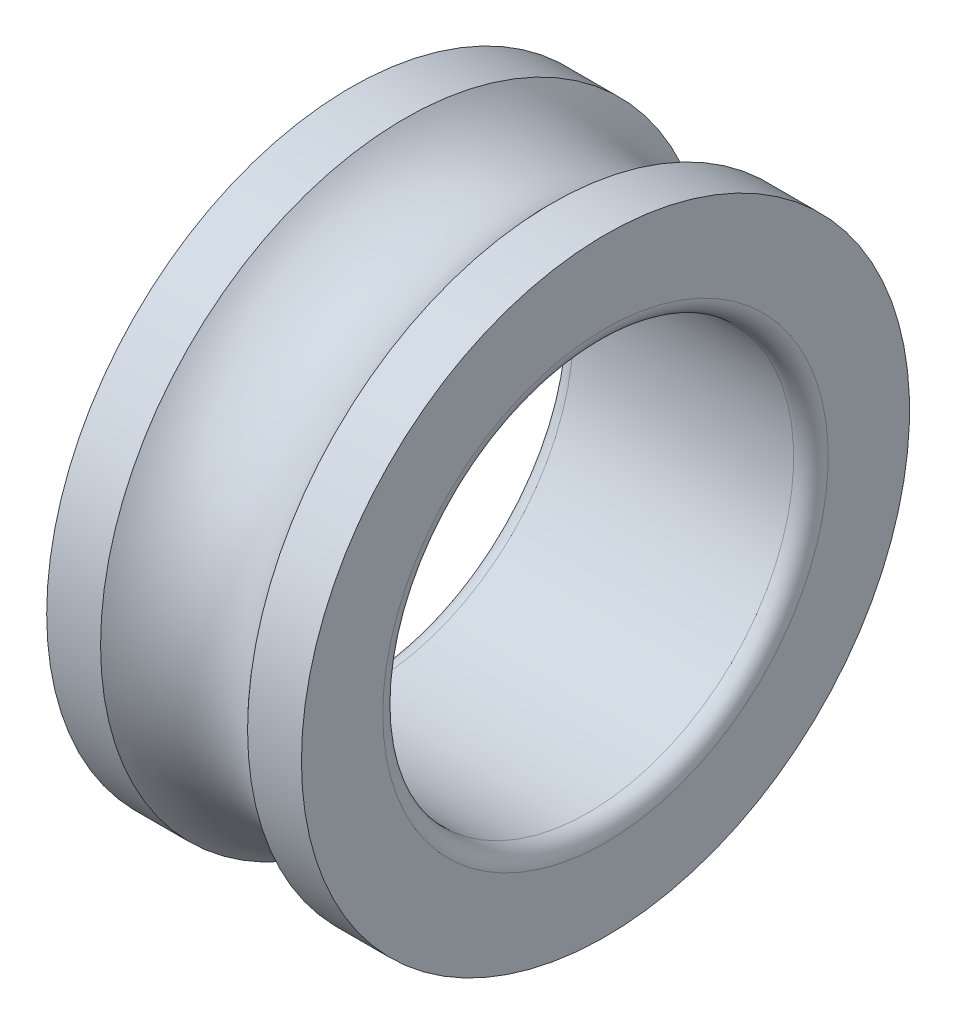
ISO-10303-21;
HEADER;
FILE_DESCRIPTION(('STEP AP214'),'2;1');
FILE_NAME('part.step','',(''),(''),'','','');
FILE_SCHEMA(('AUTOMOTIVE_DESIGN { 1 0 10303 214 1 1 1 1 }'));
ENDSEC;
DATA;
#1=APPLICATION_CONTEXT('core data for automotive mechanical design processes');
#2=APPLICATION_PROTOCOL_DEFINITION('international standard','automotive_design',2000,#1);
#3=PRODUCT_CONTEXT('',#1,'mechanical');
#4=PRODUCT('Part','Part','',(#3));
#5=PRODUCT_RELATED_PRODUCT_CATEGORY('part','',(#4));
#6=PRODUCT_DEFINITION_FORMATION('','',#4);
#7=PRODUCT_DEFINITION_CONTEXT('part definition',#1,'design');
#8=PRODUCT_DEFINITION('design','',#6,#7);
#9=PRODUCT_DEFINITION_SHAPE('','',#8);
#10=(LENGTH_UNIT() NAMED_UNIT(*) SI_UNIT(.MILLI.,.METRE.));
#11=(NAMED_UNIT(*) PLANE_ANGLE_UNIT() SI_UNIT($,.RADIAN.));
#12=(NAMED_UNIT(*) SI_UNIT($,.STERADIAN.) SOLID_ANGLE_UNIT());
#13=UNCERTAINTY_MEASURE_WITH_UNIT(LENGTH_MEASURE(1.E-05),#10,'distance_accuracy_value','');
#14=(GEOMETRIC_REPRESENTATION_CONTEXT(3) GLOBAL_UNCERTAINTY_ASSIGNED_CONTEXT((#13)) GLOBAL_UNIT_ASSIGNED_CONTEXT((#10,
#11,#12)) REPRESENTATION_CONTEXT('',''));
#15=CARTESIAN_POINT('',(0.,0.,0.));
#16=DIRECTION('',(0.,0.,1.));
#17=DIRECTION('',(1.,0.,0.));
#18=AXIS2_PLACEMENT_3D('',#15,#16,#17);
#19=CARTESIAN_POINT('',(-15.5,37.,0.));
#20=DIRECTION('',(1.,0.,0.));
#21=DIRECTION('',(0.,0.,-1.));
#22=AXIS2_PLACEMENT_3D('',#19,#20,#21);
#23=PLANE('',#22);
#24=CARTESIAN_POINT('',(-15.5,0.,0.));
#25=DIRECTION('',(-1.,0.,0.));
#26=DIRECTION('',(0.,0.,1.));
#27=AXIS2_PLACEMENT_3D('',#24,#25,#26);
#28=CIRCLE('',#27,27.1);
#29=CARTESIAN_POINT('',(-15.5,0.,27.1));
#30=VERTEX_POINT('',#29);
#31=EDGE_CURVE('E10',#30,#30,#28,.T.);
#32=ORIENTED_EDGE('',*,*,#31,.F.);
#33=EDGE_LOOP('',(#32));
#34=FACE_BOUND('',#33,.T.);
#35=CARTESIAN_POINT('',(-15.5,0.,0.));
#36=DIRECTION('',(-1.,0.,0.));
#37=DIRECTION('',(0.,0.,1.));
#38=AXIS2_PLACEMENT_3D('',#35,#36,#37);
#39=CIRCLE('',#38,37.);
#40=CARTESIAN_POINT('',(-15.5,0.,37.));
#41=VERTEX_POINT('',#40);
#42=EDGE_CURVE('E59',#41,#41,#39,.T.);
#43=ORIENTED_EDGE('',*,*,#42,.T.);
#44=EDGE_LOOP('',(#43));
#45=FACE_BOUND('',#44,.T.);
#46=ADVANCED_FACE('F31',(#34,#45),#23,.F.);
#47=CARTESIAN_POINT('',(-13.4,0.,0.));
#48=DIRECTION('',(-1.,0.,0.));
#49=DIRECTION('',(0.,0.,1.));
#50=AXIS2_PLACEMENT_3D('',#47,#48,#49);
#51=TOROIDAL_SURFACE('',#50,27.1,2.1);
#52=CARTESIAN_POINT('',(-13.4,0.,0.));
#53=DIRECTION('',(-1.,0.,0.));
#54=DIRECTION('',(0.,0.,1.));
#55=AXIS2_PLACEMENT_3D('',#52,#53,#54);
#56=CIRCLE('',#55,25.);
#57=CARTESIAN_POINT('',(-13.4,0.,25.));
#58=VERTEX_POINT('',#57);
#59=EDGE_CURVE('E37',#58,#58,#56,.T.);
#60=ORIENTED_EDGE('',*,*,#59,.F.);
#61=EDGE_LOOP('',(#60));
#62=FACE_BOUND('',#61,.T.);
#63=ORIENTED_EDGE('',*,*,#31,.T.);
#64=EDGE_LOOP('',(#63));
#65=FACE_BOUND('',#64,.T.);
#66=ADVANCED_FACE('F96',(#62,#65),#51,.T.);
#67=CARTESIAN_POINT('',(-12.3367346938775,0.,0.));
#68=DIRECTION('',(-1.,0.,0.));
#69=DIRECTION('',(0.,0.,1.));
#70=AXIS2_PLACEMENT_3D('',#67,#68,#69);
#71=CYLINDRICAL_SURFACE('',#70,25.);
#72=CARTESIAN_POINT('',(13.4,0.,0.));
#73=DIRECTION('',(-1.,0.,0.));
#74=DIRECTION('',(0.,0.,1.));
#75=AXIS2_PLACEMENT_3D('',#72,#73,#74);
#76=CIRCLE('',#75,25.);
#77=CARTESIAN_POINT('',(13.4,0.,25.));
#78=VERTEX_POINT('',#77);
#79=EDGE_CURVE('E41',#78,#78,#76,.T.);
#80=ORIENTED_EDGE('',*,*,#79,.F.);
#81=EDGE_LOOP('',(#80));
#82=FACE_BOUND('',#81,.T.);
#83=ORIENTED_EDGE('',*,*,#59,.T.);
#84=EDGE_LOOP('',(#83));
#85=FACE_BOUND('',#84,.T.);
#86=ADVANCED_FACE('F91',(#82,#85),#71,.F.);
#87=CARTESIAN_POINT('',(13.4,0.,0.));
#88=DIRECTION('',(-1.,0.,0.));
#89=DIRECTION('',(0.,0.,1.));
#90=AXIS2_PLACEMENT_3D('',#87,#88,#89);
#91=TOROIDAL_SURFACE('',#90,27.1,2.1);
#92=CARTESIAN_POINT('',(15.5,0.,0.));
#93=DIRECTION('',(-1.,0.,0.));
#94=DIRECTION('',(0.,0.,1.));
#95=AXIS2_PLACEMENT_3D('',#92,#93,#94);
#96=CIRCLE('',#95,27.1);
#97=CARTESIAN_POINT('',(15.5,0.,27.1));
#98=VERTEX_POINT('',#97);
#99=EDGE_CURVE('E45',#98,#98,#96,.T.);
#100=ORIENTED_EDGE('',*,*,#99,.F.);
#101=EDGE_LOOP('',(#100));
#102=FACE_BOUND('',#101,.T.);
#103=ORIENTED_EDGE('',*,*,#79,.T.);
#104=EDGE_LOOP('',(#103));
#105=FACE_BOUND('',#104,.T.);
#106=ADVANCED_FACE('F85',(#102,#105),#91,.T.);
#107=CARTESIAN_POINT('',(15.5,37.,0.));
#108=DIRECTION('',(-1.,0.,0.));
#109=DIRECTION('',(0.,0.,1.));
#110=AXIS2_PLACEMENT_3D('',#107,#108,#109);
#111=PLANE('',#110);
#112=CARTESIAN_POINT('',(15.5,0.,0.));
#113=DIRECTION('',(-1.,0.,0.));
#114=DIRECTION('',(0.,0.,1.));
#115=AXIS2_PLACEMENT_3D('',#112,#113,#114);
#116=CIRCLE('',#115,37.);
#117=CARTESIAN_POINT('',(15.5,0.,37.));
#118=VERTEX_POINT('',#117);
#119=EDGE_CURVE('E50',#118,#118,#116,.T.);
#120=ORIENTED_EDGE('',*,*,#119,.F.);
#121=EDGE_LOOP('',(#120));
#122=FACE_BOUND('',#121,.T.);
#123=ORIENTED_EDGE('',*,*,#99,.T.);
#124=EDGE_LOOP('',(#123));
#125=FACE_BOUND('',#124,.T.);
#126=ADVANCED_FACE('F79',(#122,#125),#111,.F.);
#127=CARTESIAN_POINT('',(-12.3367346938775,0.,0.));
#128=DIRECTION('',(-1.,0.,0.));
#129=DIRECTION('',(0.,0.,1.));
#130=AXIS2_PLACEMENT_3D('',#127,#128,#129);
#131=CYLINDRICAL_SURFACE('',#130,37.);
#132=CARTESIAN_POINT('',(8.94427190999916,0.,0.));
#133=DIRECTION('',(-1.,0.,0.));
#134=DIRECTION('',(0.,0.,1.));
#135=AXIS2_PLACEMENT_3D('',#132,#133,#134);
#136=CIRCLE('',#135,37.);
#137=CARTESIAN_POINT('',(8.94427190999916,0.,37.));
#138=VERTEX_POINT('',#137);
#139=EDGE_CURVE('E53',#138,#138,#136,.T.);
#140=ORIENTED_EDGE('',*,*,#139,.F.);
#141=EDGE_LOOP('',(#140));
#142=FACE_BOUND('',#141,.T.);
#143=ORIENTED_EDGE('',*,*,#119,.T.);
#144=EDGE_LOOP('',(#143));
#145=FACE_BOUND('',#144,.T.);
#146=ADVANCED_FACE('F73',(#142,#145),#131,.T.);
#147=CARTESIAN_POINT('',(0.,0.,0.));
#148=DIRECTION('',(-1.,0.,0.));
#149=DIRECTION('',(0.,0.,1.));
#150=AXIS2_PLACEMENT_3D('',#147,#148,#149);
#151=TOROIDAL_SURFACE('',#150,45.,12.);
#152=CARTESIAN_POINT('',(-8.94427190999916,0.,0.));
#153=DIRECTION('',(-1.,0.,0.));
#154=DIRECTION('',(0.,0.,1.));
#155=AXIS2_PLACEMENT_3D('',#152,#153,#154);
#156=CIRCLE('',#155,37.);
#157=CARTESIAN_POINT('',(-8.94427190999916,0.,37.));
#158=VERTEX_POINT('',#157);
#159=EDGE_CURVE('E56',#158,#158,#156,.T.);
#160=ORIENTED_EDGE('',*,*,#159,.F.);
#161=EDGE_LOOP('',(#160));
#162=FACE_BOUND('',#161,.T.);
#163=ORIENTED_EDGE('',*,*,#139,.T.);
#164=EDGE_LOOP('',(#163));
#165=FACE_BOUND('',#164,.T.);
#166=ADVANCED_FACE('F67',(#162,#165),#151,.F.);
#167=CARTESIAN_POINT('',(-12.3367346938775,0.,0.));
#168=DIRECTION('',(-1.,0.,0.));
#169=DIRECTION('',(0.,0.,1.));
#170=AXIS2_PLACEMENT_3D('',#167,#168,#169);
#171=CYLINDRICAL_SURFACE('',#170,37.);
#172=ORIENTED_EDGE('',*,*,#42,.F.);
#173=EDGE_LOOP('',(#172));
#174=FACE_BOUND('',#173,.T.);
#175=ORIENTED_EDGE('',*,*,#159,.T.);
#176=EDGE_LOOP('',(#175));
#177=FACE_BOUND('',#176,.T.);
#178=ADVANCED_FACE('F64',(#174,#177),#171,.T.);
#179=CLOSED_SHELL('',(#46,#66,#86,#106,#126,#146,#166,#178));
#180=MANIFOLD_SOLID_BREP('B2',#179);
#181=ADVANCED_BREP_SHAPE_REPRESENTATION('',(#18,#180),#14);
#182=SHAPE_DEFINITION_REPRESENTATION(#9,#181);
ENDSEC;
END-ISO-10303-21;
